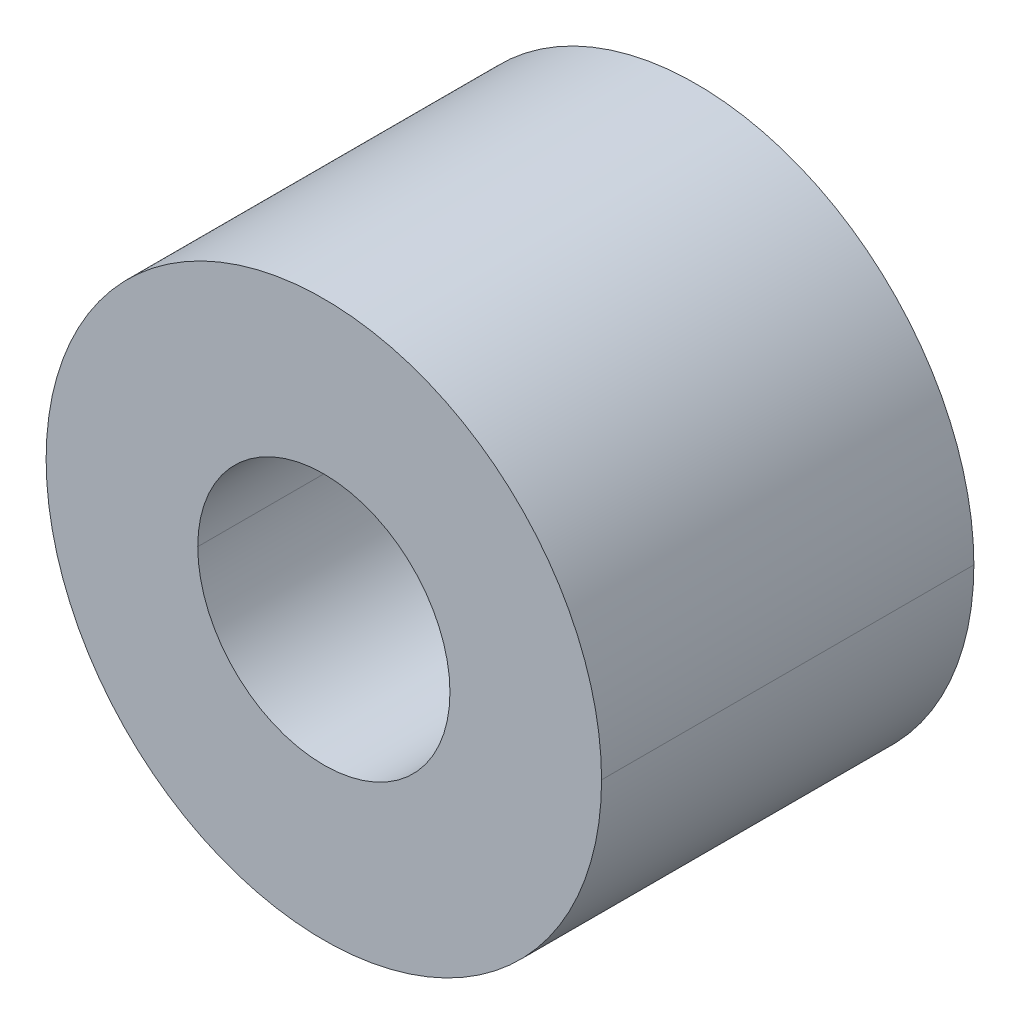
ISO-10303-21;
HEADER;
FILE_DESCRIPTION(('STEP AP214'),'2;1');
FILE_NAME('part.step','',(''),(''),'','','');
FILE_SCHEMA(('AUTOMOTIVE_DESIGN { 1 0 10303 214 1 1 1 1 }'));
ENDSEC;
DATA;
#1=APPLICATION_CONTEXT('core data for automotive mechanical design processes');
#2=APPLICATION_PROTOCOL_DEFINITION('international standard','automotive_design',2000,#1);
#3=PRODUCT_CONTEXT('',#1,'mechanical');
#4=PRODUCT('Part','Part','',(#3));
#5=PRODUCT_RELATED_PRODUCT_CATEGORY('part','',(#4));
#6=PRODUCT_DEFINITION_FORMATION('','',#4);
#7=PRODUCT_DEFINITION_CONTEXT('part definition',#1,'design');
#8=PRODUCT_DEFINITION('design','',#6,#7);
#9=PRODUCT_DEFINITION_SHAPE('','',#8);
#10=(LENGTH_UNIT() NAMED_UNIT(*) SI_UNIT(.MILLI.,.METRE.));
#11=(NAMED_UNIT(*) PLANE_ANGLE_UNIT() SI_UNIT($,.RADIAN.));
#12=(NAMED_UNIT(*) SI_UNIT($,.STERADIAN.) SOLID_ANGLE_UNIT());
#13=UNCERTAINTY_MEASURE_WITH_UNIT(LENGTH_MEASURE(1.E-05),#10,'distance_accuracy_value','');
#14=(GEOMETRIC_REPRESENTATION_CONTEXT(3) GLOBAL_UNCERTAINTY_ASSIGNED_CONTEXT((#13)) GLOBAL_UNIT_ASSIGNED_CONTEXT((#10,
#11,#12)) REPRESENTATION_CONTEXT('',''));
#15=CARTESIAN_POINT('',(0.,0.,0.));
#16=DIRECTION('',(0.,0.,1.));
#17=DIRECTION('',(1.,0.,0.));
#18=AXIS2_PLACEMENT_3D('',#15,#16,#17);
#19=CARTESIAN_POINT('',(0.,0.,0.));
#20=DIRECTION('',(0.,0.,-1.));
#21=DIRECTION('',(0.,-1.,0.));
#22=AXIS2_PLACEMENT_3D('',#19,#20,#21);
#23=PLANE('',#22);
#24=CARTESIAN_POINT('',(0.,0.,0.));
#25=DIRECTION('',(0.,0.,-1.));
#26=DIRECTION('',(1.,0.,0.));
#27=AXIS2_PLACEMENT_3D('',#24,#25,#26);
#28=CIRCLE('',#27,4.625);
#29=CARTESIAN_POINT('',(4.625,0.,0.));
#30=VERTEX_POINT('',#29);
#31=CARTESIAN_POINT('',(-4.625,0.,0.));
#32=VERTEX_POINT('',#31);
#33=EDGE_CURVE('E11',#30,#32,#28,.T.);
#34=ORIENTED_EDGE('',*,*,#33,.T.);
#35=CARTESIAN_POINT('',(0.,0.,0.));
#36=DIRECTION('',(0.,0.,-1.));
#37=DIRECTION('',(1.,0.,0.));
#38=AXIS2_PLACEMENT_3D('',#35,#36,#37);
#39=CIRCLE('',#38,4.625);
#40=EDGE_CURVE('E26',#32,#30,#39,.T.);
#41=ORIENTED_EDGE('',*,*,#40,.T.);
#42=EDGE_LOOP('',(#34,#41));
#43=FACE_BOUND('',#42,.T.);
#44=CARTESIAN_POINT('',(0.,0.,0.));
#45=DIRECTION('',(0.,0.,-1.));
#46=DIRECTION('',(1.,0.,0.));
#47=AXIS2_PLACEMENT_3D('',#44,#45,#46);
#48=CIRCLE('',#47,2.09999999963);
#49=CARTESIAN_POINT('',(-2.09999999963,0.,0.));
#50=VERTEX_POINT('',#49);
#51=CARTESIAN_POINT('',(2.09999999963,0.,0.));
#52=VERTEX_POINT('',#51);
#53=EDGE_CURVE('E67',#50,#52,#48,.T.);
#54=ORIENTED_EDGE('',*,*,#53,.F.);
#55=CARTESIAN_POINT('',(0.,0.,0.));
#56=DIRECTION('',(0.,0.,-1.));
#57=DIRECTION('',(1.,0.,0.));
#58=AXIS2_PLACEMENT_3D('',#55,#56,#57);
#59=CIRCLE('',#58,2.09999999963);
#60=EDGE_CURVE('E65',#52,#50,#59,.T.);
#61=ORIENTED_EDGE('',*,*,#60,.F.);
#62=EDGE_LOOP('',(#54,#61));
#63=FACE_BOUND('',#62,.T.);
#64=ADVANCED_FACE('F16',(#43,#63),#23,.T.);
#65=CARTESIAN_POINT('',(0.,0.,6.2));
#66=DIRECTION('',(0.,0.,1.));
#67=DIRECTION('',(-1.,0.,0.));
#68=AXIS2_PLACEMENT_3D('',#65,#66,#67);
#69=CYLINDRICAL_SURFACE('',#68,4.625);
#70=DIRECTION('',(0.,0.,-1.));
#71=VECTOR('',#70,1.);
#72=CARTESIAN_POINT('',(-4.625,0.,6.19999999925));
#73=LINE('',#72,#71);
#74=CARTESIAN_POINT('',(-4.625,0.,6.2));
#75=VERTEX_POINT('',#74);
#76=EDGE_CURVE('E19',#75,#32,#73,.T.);
#77=ORIENTED_EDGE('',*,*,#76,.T.);
#78=ORIENTED_EDGE('',*,*,#33,.F.);
#79=DIRECTION('',(0.,0.,1.));
#80=VECTOR('',#79,1.);
#81=CARTESIAN_POINT('',(4.625,0.,6.19999999925));
#82=LINE('',#81,#80);
#83=CARTESIAN_POINT('',(4.625,0.,6.2));
#84=VERTEX_POINT('',#83);
#85=EDGE_CURVE('E96',#30,#84,#82,.T.);
#86=ORIENTED_EDGE('',*,*,#85,.T.);
#87=CARTESIAN_POINT('',(0.,0.,6.2));
#88=DIRECTION('',(0.,0.,-1.));
#89=DIRECTION('',(1.,0.,0.));
#90=AXIS2_PLACEMENT_3D('',#87,#88,#89);
#91=CIRCLE('',#90,4.625);
#92=EDGE_CURVE('E94',#84,#75,#91,.T.);
#93=ORIENTED_EDGE('',*,*,#92,.T.);
#94=EDGE_LOOP('',(#77,#78,#86,#93));
#95=FACE_BOUND('',#94,.T.);
#96=ADVANCED_FACE('F118',(#95),#69,.T.);
#97=CARTESIAN_POINT('',(0.,0.,6.2));
#98=DIRECTION('',(0.,0.,1.));
#99=DIRECTION('',(1.,0.,0.));
#100=AXIS2_PLACEMENT_3D('',#97,#98,#99);
#101=CYLINDRICAL_SURFACE('',#100,4.625);
#102=ORIENTED_EDGE('',*,*,#85,.F.);
#103=ORIENTED_EDGE('',*,*,#40,.F.);
#104=ORIENTED_EDGE('',*,*,#76,.F.);
#105=CARTESIAN_POINT('',(0.,0.,6.2));
#106=DIRECTION('',(0.,0.,-1.));
#107=DIRECTION('',(1.,0.,0.));
#108=AXIS2_PLACEMENT_3D('',#105,#106,#107);
#109=CIRCLE('',#108,4.625);
#110=EDGE_CURVE('E97',#75,#84,#109,.T.);
#111=ORIENTED_EDGE('',*,*,#110,.T.);
#112=EDGE_LOOP('',(#102,#103,#104,#111));
#113=FACE_BOUND('',#112,.T.);
#114=ADVANCED_FACE('F119',(#113),#101,.T.);
#115=CARTESIAN_POINT('',(0.,0.,6.2));
#116=DIRECTION('',(0.,0.,1.));
#117=DIRECTION('',(1.,0.,0.));
#118=AXIS2_PLACEMENT_3D('',#115,#116,#117);
#119=CYLINDRICAL_SURFACE('',#118,2.1);
#120=CARTESIAN_POINT('',(0.,0.,6.2));
#121=DIRECTION('',(0.,0.,-1.));
#122=DIRECTION('',(1.,0.,0.));
#123=AXIS2_PLACEMENT_3D('',#120,#121,#122);
#124=CIRCLE('',#123,2.1);
#125=CARTESIAN_POINT('',(-2.09999999963,0.,6.2));
#126=VERTEX_POINT('',#125);
#127=CARTESIAN_POINT('',(2.09999999963,0.,6.2));
#128=VERTEX_POINT('',#127);
#129=EDGE_CURVE('E92',#126,#128,#124,.T.);
#130=ORIENTED_EDGE('',*,*,#129,.F.);
#131=DIRECTION('',(0.,0.,-1.));
#132=VECTOR('',#131,1.);
#133=CARTESIAN_POINT('',(-2.1,0.,6.19999999925));
#134=LINE('',#133,#132);
#135=EDGE_CURVE('E80',#126,#50,#134,.T.);
#136=ORIENTED_EDGE('',*,*,#135,.T.);
#137=ORIENTED_EDGE('',*,*,#53,.T.);
#138=DIRECTION('',(0.,0.,1.));
#139=VECTOR('',#138,1.);
#140=CARTESIAN_POINT('',(2.1,0.,6.19999999925));
#141=LINE('',#140,#139);
#142=EDGE_CURVE('E73',#52,#128,#141,.T.);
#143=ORIENTED_EDGE('',*,*,#142,.T.);
#144=EDGE_LOOP('',(#130,#136,#137,#143));
#145=FACE_BOUND('',#144,.T.);
#146=ADVANCED_FACE('F78',(#145),#119,.F.);
#147=CARTESIAN_POINT('',(0.,0.,6.2));
#148=DIRECTION('',(0.,0.,1.));
#149=DIRECTION('',(-1.,0.,0.));
#150=AXIS2_PLACEMENT_3D('',#147,#148,#149);
#151=CYLINDRICAL_SURFACE('',#150,2.1);
#152=CARTESIAN_POINT('',(0.,0.,6.2));
#153=DIRECTION('',(0.,0.,-1.));
#154=DIRECTION('',(1.,0.,0.));
#155=AXIS2_PLACEMENT_3D('',#152,#153,#154);
#156=CIRCLE('',#155,2.1);
#157=EDGE_CURVE('E74',#128,#126,#156,.T.);
#158=ORIENTED_EDGE('',*,*,#157,.F.);
#159=ORIENTED_EDGE('',*,*,#142,.F.);
#160=ORIENTED_EDGE('',*,*,#60,.T.);
#161=ORIENTED_EDGE('',*,*,#135,.F.);
#162=EDGE_LOOP('',(#158,#159,#160,#161));
#163=FACE_BOUND('',#162,.T.);
#164=ADVANCED_FACE('F83',(#163),#151,.F.);
#165=CARTESIAN_POINT('',(0.,0.,6.2));
#166=DIRECTION('',(0.,0.,-1.));
#167=DIRECTION('',(0.,-1.,0.));
#168=AXIS2_PLACEMENT_3D('',#165,#166,#167);
#169=PLANE('',#168);
#170=ORIENTED_EDGE('',*,*,#110,.F.);
#171=ORIENTED_EDGE('',*,*,#92,.F.);
#172=EDGE_LOOP('',(#170,#171));
#173=FACE_BOUND('',#172,.T.);
#174=ORIENTED_EDGE('',*,*,#157,.T.);
#175=ORIENTED_EDGE('',*,*,#129,.T.);
#176=EDGE_LOOP('',(#174,#175));
#177=FACE_BOUND('',#176,.T.);
#178=ADVANCED_FACE('F121',(#173,#177),#169,.F.);
#179=CLOSED_SHELL('',(#64,#96,#114,#146,#164,#178));
#180=MANIFOLD_SOLID_BREP('B1',#179);
#181=ADVANCED_BREP_SHAPE_REPRESENTATION('',(#18,#180),#14);
#182=SHAPE_DEFINITION_REPRESENTATION(#9,#181);
ENDSEC;
END-ISO-10303-21;
